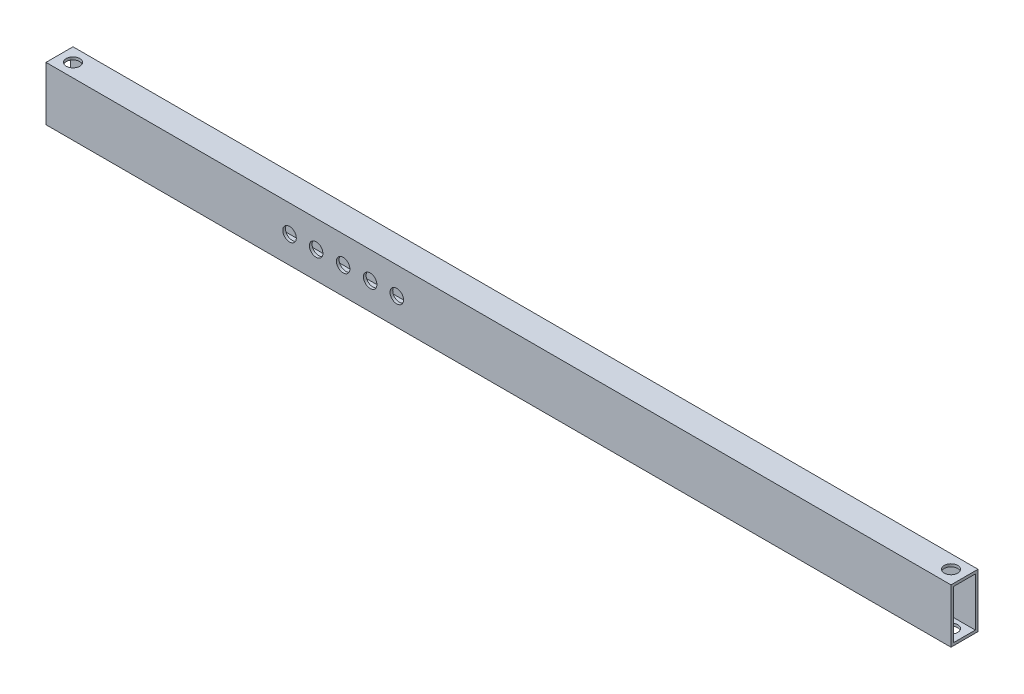
ISO-10303-21;
HEADER;
FILE_DESCRIPTION(('STEP AP214'),'2;1');
FILE_NAME('part.step','',(''),(''),'','','');
FILE_SCHEMA(('AUTOMOTIVE_DESIGN { 1 0 10303 214 1 1 1 1 }'));
ENDSEC;
DATA;
#1=APPLICATION_CONTEXT('core data for automotive mechanical design processes');
#2=APPLICATION_PROTOCOL_DEFINITION('international standard','automotive_design',2000,#1);
#3=PRODUCT_CONTEXT('',#1,'mechanical');
#4=PRODUCT('Part','Part','',(#3));
#5=PRODUCT_RELATED_PRODUCT_CATEGORY('part','',(#4));
#6=PRODUCT_DEFINITION_FORMATION('','',#4);
#7=PRODUCT_DEFINITION_CONTEXT('part definition',#1,'design');
#8=PRODUCT_DEFINITION('design','',#6,#7);
#9=PRODUCT_DEFINITION_SHAPE('','',#8);
#10=(LENGTH_UNIT() NAMED_UNIT(*) SI_UNIT(.MILLI.,.METRE.));
#11=(NAMED_UNIT(*) PLANE_ANGLE_UNIT() SI_UNIT($,.RADIAN.));
#12=(NAMED_UNIT(*) SI_UNIT($,.STERADIAN.) SOLID_ANGLE_UNIT());
#13=UNCERTAINTY_MEASURE_WITH_UNIT(LENGTH_MEASURE(1.E-05),#10,'distance_accuracy_value','');
#14=(GEOMETRIC_REPRESENTATION_CONTEXT(3) GLOBAL_UNCERTAINTY_ASSIGNED_CONTEXT((#13)) GLOBAL_UNIT_ASSIGNED_CONTEXT((#10,
#11,#12)) REPRESENTATION_CONTEXT('',''));
#15=CARTESIAN_POINT('',(0.,0.,0.));
#16=DIRECTION('',(0.,0.,1.));
#17=DIRECTION('',(1.,0.,0.));
#18=AXIS2_PLACEMENT_3D('',#15,#16,#17);
#19=CARTESIAN_POINT('',(-110.,-10.,-5.));
#20=DIRECTION('',(0.,0.,-1.));
#21=DIRECTION('',(-1.,0.,0.));
#22=AXIS2_PLACEMENT_3D('',#19,#20,#21);
#23=PLANE('',#22);
#24=DIRECTION('',(1.,0.,0.));
#25=VECTOR('',#24,1.);
#26=CARTESIAN_POINT('',(-110.,10.,-5.));
#27=LINE('',#26,#25);
#28=CARTESIAN_POINT('',(-110.,10.,-5.));
#29=VERTEX_POINT('',#28);
#30=CARTESIAN_POINT('',(225.,10.,-5.));
#31=VERTEX_POINT('',#30);
#32=EDGE_CURVE('E172',#29,#31,#27,.T.);
#33=ORIENTED_EDGE('',*,*,#32,.T.);
#34=DIRECTION('',(0.,1.,0.));
#35=VECTOR('',#34,1.);
#36=CARTESIAN_POINT('',(225.,-10.,-5.));
#37=LINE('',#36,#35);
#38=CARTESIAN_POINT('',(225.,-10.,-5.));
#39=VERTEX_POINT('',#38);
#40=EDGE_CURVE('E140',#39,#31,#37,.T.);
#41=ORIENTED_EDGE('',*,*,#40,.F.);
#42=DIRECTION('',(1.,0.,0.));
#43=VECTOR('',#42,1.);
#44=CARTESIAN_POINT('',(-110.,-10.,-5.));
#45=LINE('',#44,#43);
#46=CARTESIAN_POINT('',(-110.,-10.,-5.));
#47=VERTEX_POINT('',#46);
#48=EDGE_CURVE('E11',#47,#39,#45,.T.);
#49=ORIENTED_EDGE('',*,*,#48,.F.);
#50=DIRECTION('',(0.,1.,0.));
#51=VECTOR('',#50,1.);
#52=CARTESIAN_POINT('',(-110.,-10.,-5.));
#53=LINE('',#52,#51);
#54=EDGE_CURVE('E159',#47,#29,#53,.T.);
#55=ORIENTED_EDGE('',*,*,#54,.T.);
#56=EDGE_LOOP('',(#33,#41,#49,#55));
#57=FACE_BOUND('',#56,.T.);
#58=ADVANCED_FACE('F43',(#57),#23,.T.);
#59=CARTESIAN_POINT('',(-110.,-10.,5.));
#60=DIRECTION('',(0.,-1.,0.));
#61=DIRECTION('',(0.,0.,-1.));
#62=AXIS2_PLACEMENT_3D('',#59,#60,#61);
#63=PLANE('',#62);
#64=CARTESIAN_POINT('',(220.,-10.,0.));
#65=DIRECTION('',(0.,1.,0.));
#66=DIRECTION('',(0.,0.,1.));
#67=AXIS2_PLACEMENT_3D('',#64,#65,#66);
#68=CIRCLE('',#67,2.5);
#69=CARTESIAN_POINT('',(220.,-10.,2.5));
#70=VERTEX_POINT('',#69);
#71=EDGE_CURVE('E180',#70,#70,#68,.T.);
#72=ORIENTED_EDGE('',*,*,#71,.T.);
#73=EDGE_LOOP('',(#72));
#74=FACE_BOUND('',#73,.T.);
#75=CARTESIAN_POINT('',(-105.,-10.,0.));
#76=DIRECTION('',(0.,1.,0.));
#77=DIRECTION('',(0.,0.,1.));
#78=AXIS2_PLACEMENT_3D('',#75,#76,#77);
#79=CIRCLE('',#78,2.49999999999999);
#80=CARTESIAN_POINT('',(-105.,-10.,2.49999999999999));
#81=VERTEX_POINT('',#80);
#82=EDGE_CURVE('E196',#81,#81,#79,.T.);
#83=ORIENTED_EDGE('',*,*,#82,.T.);
#84=EDGE_LOOP('',(#83));
#85=FACE_BOUND('',#84,.T.);
#86=ORIENTED_EDGE('',*,*,#48,.T.);
#87=DIRECTION('',(0.,0.,-1.));
#88=VECTOR('',#87,1.);
#89=CARTESIAN_POINT('',(225.,-10.,5.));
#90=LINE('',#89,#88);
#91=CARTESIAN_POINT('',(225.,-10.,5.));
#92=VERTEX_POINT('',#91);
#93=EDGE_CURVE('E149',#92,#39,#90,.T.);
#94=ORIENTED_EDGE('',*,*,#93,.F.);
#95=DIRECTION('',(1.,0.,0.));
#96=VECTOR('',#95,1.);
#97=CARTESIAN_POINT('',(-110.,-10.,5.));
#98=LINE('',#97,#96);
#99=CARTESIAN_POINT('',(-110.,-10.,5.));
#100=VERTEX_POINT('',#99);
#101=EDGE_CURVE('E51',#100,#92,#98,.T.);
#102=ORIENTED_EDGE('',*,*,#101,.F.);
#103=DIRECTION('',(0.,0.,-1.));
#104=VECTOR('',#103,1.);
#105=CARTESIAN_POINT('',(-110.,-10.,5.));
#106=LINE('',#105,#104);
#107=EDGE_CURVE('E170',#100,#47,#106,.T.);
#108=ORIENTED_EDGE('',*,*,#107,.T.);
#109=EDGE_LOOP('',(#86,#94,#102,#108));
#110=FACE_BOUND('',#109,.T.);
#111=ADVANCED_FACE('F245',(#74,#85,#110),#63,.T.);
#112=CARTESIAN_POINT('',(-110.,-10.,5.));
#113=DIRECTION('',(0.,0.,1.));
#114=DIRECTION('',(1.,0.,0.));
#115=AXIS2_PLACEMENT_3D('',#112,#113,#114);
#116=PLANE('',#115);
#117=CARTESIAN_POINT('',(-19.85,0.,5.));
#118=DIRECTION('',(0.,0.,1.));
#119=DIRECTION('',(1.,0.,0.));
#120=AXIS2_PLACEMENT_3D('',#117,#118,#119);
#121=CIRCLE('',#120,2.5);
#122=CARTESIAN_POINT('',(-17.35,0.,5.));
#123=VERTEX_POINT('',#122);
#124=EDGE_CURVE('E205',#123,#123,#121,.T.);
#125=ORIENTED_EDGE('',*,*,#124,.F.);
#126=EDGE_LOOP('',(#125));
#127=FACE_BOUND('',#126,.T.);
#128=CARTESIAN_POINT('',(-10.,0.,5.));
#129=DIRECTION('',(0.,0.,1.));
#130=DIRECTION('',(1.,0.,0.));
#131=AXIS2_PLACEMENT_3D('',#128,#129,#130);
#132=CIRCLE('',#131,2.5);
#133=CARTESIAN_POINT('',(-7.5,0.,5.));
#134=VERTEX_POINT('',#133);
#135=EDGE_CURVE('E208',#134,#134,#132,.T.);
#136=ORIENTED_EDGE('',*,*,#135,.F.);
#137=EDGE_LOOP('',(#136));
#138=FACE_BOUND('',#137,.T.);
#139=CARTESIAN_POINT('',(0.,0.,5.));
#140=DIRECTION('',(0.,0.,1.));
#141=DIRECTION('',(1.,0.,0.));
#142=AXIS2_PLACEMENT_3D('',#139,#140,#141);
#143=CIRCLE('',#142,2.5);
#144=CARTESIAN_POINT('',(2.5,0.,5.));
#145=VERTEX_POINT('',#144);
#146=EDGE_CURVE('E214',#145,#145,#143,.T.);
#147=ORIENTED_EDGE('',*,*,#146,.F.);
#148=EDGE_LOOP('',(#147));
#149=FACE_BOUND('',#148,.T.);
#150=CARTESIAN_POINT('',(19.85,0.,5.));
#151=DIRECTION('',(0.,0.,1.));
#152=DIRECTION('',(-1.,0.,0.));
#153=AXIS2_PLACEMENT_3D('',#150,#151,#152);
#154=CIRCLE('',#153,2.5);
#155=CARTESIAN_POINT('',(17.35,0.,5.));
#156=VERTEX_POINT('',#155);
#157=EDGE_CURVE('E220',#156,#156,#154,.T.);
#158=ORIENTED_EDGE('',*,*,#157,.F.);
#159=EDGE_LOOP('',(#158));
#160=FACE_BOUND('',#159,.T.);
#161=CARTESIAN_POINT('',(10.,0.,5.));
#162=DIRECTION('',(0.,0.,1.));
#163=DIRECTION('',(-1.,0.,0.));
#164=AXIS2_PLACEMENT_3D('',#161,#162,#163);
#165=CIRCLE('',#164,2.5);
#166=CARTESIAN_POINT('',(7.5,0.,5.));
#167=VERTEX_POINT('',#166);
#168=EDGE_CURVE('E226',#167,#167,#165,.T.);
#169=ORIENTED_EDGE('',*,*,#168,.F.);
#170=EDGE_LOOP('',(#169));
#171=FACE_BOUND('',#170,.T.);
#172=ORIENTED_EDGE('',*,*,#101,.T.);
#173=DIRECTION('',(0.,-1.,0.));
#174=VECTOR('',#173,1.);
#175=CARTESIAN_POINT('',(225.,-10.,5.));
#176=LINE('',#175,#174);
#177=CARTESIAN_POINT('',(225.,10.,5.));
#178=VERTEX_POINT('',#177);
#179=EDGE_CURVE('E146',#178,#92,#176,.T.);
#180=ORIENTED_EDGE('',*,*,#179,.F.);
#181=DIRECTION('',(1.,0.,0.));
#182=VECTOR('',#181,1.);
#183=CARTESIAN_POINT('',(-110.,10.,5.));
#184=LINE('',#183,#182);
#185=CARTESIAN_POINT('',(-110.,10.,5.));
#186=VERTEX_POINT('',#185);
#187=EDGE_CURVE('E175',#186,#178,#184,.T.);
#188=ORIENTED_EDGE('',*,*,#187,.F.);
#189=DIRECTION('',(0.,-1.,0.));
#190=VECTOR('',#189,1.);
#191=CARTESIAN_POINT('',(-110.,-10.,5.));
#192=LINE('',#191,#190);
#193=EDGE_CURVE('E167',#186,#100,#192,.T.);
#194=ORIENTED_EDGE('',*,*,#193,.T.);
#195=EDGE_LOOP('',(#172,#180,#188,#194));
#196=FACE_BOUND('',#195,.T.);
#197=ADVANCED_FACE('F241',(#127,#138,#149,#160,#171,#196),#116,.T.);
#198=CARTESIAN_POINT('',(-110.,10.,5.));
#199=DIRECTION('',(0.,1.,0.));
#200=DIRECTION('',(0.,0.,1.));
#201=AXIS2_PLACEMENT_3D('',#198,#199,#200);
#202=PLANE('',#201);
#203=CARTESIAN_POINT('',(220.,10.,0.));
#204=DIRECTION('',(0.,1.,0.));
#205=DIRECTION('',(0.,0.,1.));
#206=AXIS2_PLACEMENT_3D('',#203,#204,#205);
#207=CIRCLE('',#206,2.5);
#208=CARTESIAN_POINT('',(220.,10.,2.5));
#209=VERTEX_POINT('',#208);
#210=EDGE_CURVE('E186',#209,#209,#207,.T.);
#211=ORIENTED_EDGE('',*,*,#210,.F.);
#212=EDGE_LOOP('',(#211));
#213=FACE_BOUND('',#212,.T.);
#214=CARTESIAN_POINT('',(-105.,10.,0.));
#215=DIRECTION('',(0.,1.,0.));
#216=DIRECTION('',(0.,0.,1.));
#217=AXIS2_PLACEMENT_3D('',#214,#215,#216);
#218=CIRCLE('',#217,2.49999999999999);
#219=CARTESIAN_POINT('',(-105.,10.,2.49999999999999));
#220=VERTEX_POINT('',#219);
#221=EDGE_CURVE('E191',#220,#220,#218,.T.);
#222=ORIENTED_EDGE('',*,*,#221,.F.);
#223=EDGE_LOOP('',(#222));
#224=FACE_BOUND('',#223,.T.);
#225=ORIENTED_EDGE('',*,*,#187,.T.);
#226=DIRECTION('',(0.,0.,1.));
#227=VECTOR('',#226,1.);
#228=CARTESIAN_POINT('',(225.,10.,5.));
#229=LINE('',#228,#227);
#230=EDGE_CURVE('E143',#31,#178,#229,.T.);
#231=ORIENTED_EDGE('',*,*,#230,.F.);
#232=ORIENTED_EDGE('',*,*,#32,.F.);
#233=DIRECTION('',(0.,0.,1.));
#234=VECTOR('',#233,1.);
#235=CARTESIAN_POINT('',(-110.,10.,5.));
#236=LINE('',#235,#234);
#237=EDGE_CURVE('E164',#29,#186,#236,.T.);
#238=ORIENTED_EDGE('',*,*,#237,.T.);
#239=EDGE_LOOP('',(#225,#231,#232,#238));
#240=FACE_BOUND('',#239,.T.);
#241=ADVANCED_FACE('F244',(#213,#224,#240),#202,.T.);
#242=CARTESIAN_POINT('',(-110.,0.,0.));
#243=DIRECTION('',(-1.,0.,0.));
#244=DIRECTION('',(0.,0.,1.));
#245=AXIS2_PLACEMENT_3D('',#242,#243,#244);
#246=PLANE('',#245);
#247=DIRECTION('',(0.,0.,-1.));
#248=VECTOR('',#247,1.);
#249=CARTESIAN_POINT('',(-110.,-9.,4.));
#250=LINE('',#249,#248);
#251=CARTESIAN_POINT('',(-110.,-9.,4.));
#252=VERTEX_POINT('',#251);
#253=CARTESIAN_POINT('',(-110.,-9.,-4.));
#254=VERTEX_POINT('',#253);
#255=EDGE_CURVE('E152',#252,#254,#250,.T.);
#256=ORIENTED_EDGE('',*,*,#255,.T.);
#257=DIRECTION('',(0.,1.,0.));
#258=VECTOR('',#257,1.);
#259=CARTESIAN_POINT('',(-110.,-9.,-4.));
#260=LINE('',#259,#258);
#261=CARTESIAN_POINT('',(-110.,9.,-4.));
#262=VERTEX_POINT('',#261);
#263=EDGE_CURVE('E115',#254,#262,#260,.T.);
#264=ORIENTED_EDGE('',*,*,#263,.T.);
#265=DIRECTION('',(0.,0.,1.));
#266=VECTOR('',#265,1.);
#267=CARTESIAN_POINT('',(-110.,9.,4.));
#268=LINE('',#267,#266);
#269=CARTESIAN_POINT('',(-110.,9.,4.));
#270=VERTEX_POINT('',#269);
#271=EDGE_CURVE('E59',#262,#270,#268,.T.);
#272=ORIENTED_EDGE('',*,*,#271,.T.);
#273=DIRECTION('',(0.,-1.,0.));
#274=VECTOR('',#273,1.);
#275=CARTESIAN_POINT('',(-110.,-9.,4.));
#276=LINE('',#275,#274);
#277=EDGE_CURVE('E120',#270,#252,#276,.T.);
#278=ORIENTED_EDGE('',*,*,#277,.T.);
#279=EDGE_LOOP('',(#256,#264,#272,#278));
#280=FACE_BOUND('',#279,.T.);
#281=ORIENTED_EDGE('',*,*,#54,.F.);
#282=ORIENTED_EDGE('',*,*,#107,.F.);
#283=ORIENTED_EDGE('',*,*,#193,.F.);
#284=ORIENTED_EDGE('',*,*,#237,.F.);
#285=EDGE_LOOP('',(#281,#282,#283,#284));
#286=FACE_BOUND('',#285,.T.);
#287=ADVANCED_FACE('F256',(#280,#286),#246,.T.);
#288=CARTESIAN_POINT('',(-110.,-9.,4.));
#289=DIRECTION('',(0.,-1.,0.));
#290=DIRECTION('',(0.,0.,-1.));
#291=AXIS2_PLACEMENT_3D('',#288,#289,#290);
#292=PLANE('',#291);
#293=CARTESIAN_POINT('',(220.,-9.,0.));
#294=DIRECTION('',(0.,-1.,0.));
#295=DIRECTION('',(0.,0.,-1.));
#296=AXIS2_PLACEMENT_3D('',#293,#294,#295);
#297=CIRCLE('',#296,2.5);
#298=CARTESIAN_POINT('',(220.,-9.,-2.5));
#299=VERTEX_POINT('',#298);
#300=EDGE_CURVE('E199',#299,#299,#297,.T.);
#301=ORIENTED_EDGE('',*,*,#300,.T.);
#302=EDGE_LOOP('',(#301));
#303=FACE_BOUND('',#302,.T.);
#304=CARTESIAN_POINT('',(-105.,-9.,0.));
#305=DIRECTION('',(0.,-1.,0.));
#306=DIRECTION('',(0.,0.,-1.));
#307=AXIS2_PLACEMENT_3D('',#304,#305,#306);
#308=CIRCLE('',#307,2.49999999999999);
#309=CARTESIAN_POINT('',(-105.,-9.,-2.49999999999999));
#310=VERTEX_POINT('',#309);
#311=EDGE_CURVE('E179',#310,#310,#308,.T.);
#312=ORIENTED_EDGE('',*,*,#311,.T.);
#313=EDGE_LOOP('',(#312));
#314=FACE_BOUND('',#313,.T.);
#315=DIRECTION('',(1.,0.,0.));
#316=VECTOR('',#315,1.);
#317=CARTESIAN_POINT('',(-110.,-9.,4.));
#318=LINE('',#317,#316);
#319=CARTESIAN_POINT('',(225.,-9.,4.));
#320=VERTEX_POINT('',#319);
#321=EDGE_CURVE('E125',#252,#320,#318,.T.);
#322=ORIENTED_EDGE('',*,*,#321,.T.);
#323=DIRECTION('',(0.,0.,-1.));
#324=VECTOR('',#323,1.);
#325=CARTESIAN_POINT('',(225.,-9.,4.));
#326=LINE('',#325,#324);
#327=CARTESIAN_POINT('',(225.,-9.,-4.));
#328=VERTEX_POINT('',#327);
#329=EDGE_CURVE('E123',#320,#328,#326,.T.);
#330=ORIENTED_EDGE('',*,*,#329,.T.);
#331=DIRECTION('',(1.,0.,0.));
#332=VECTOR('',#331,1.);
#333=CARTESIAN_POINT('',(-110.,-9.,-4.));
#334=LINE('',#333,#332);
#335=EDGE_CURVE('E108',#254,#328,#334,.T.);
#336=ORIENTED_EDGE('',*,*,#335,.F.);
#337=ORIENTED_EDGE('',*,*,#255,.F.);
#338=EDGE_LOOP('',(#322,#330,#336,#337));
#339=FACE_BOUND('',#338,.T.);
#340=ADVANCED_FACE('F124',(#303,#314,#339),#292,.F.);
#341=CARTESIAN_POINT('',(-110.,-9.,4.));
#342=DIRECTION('',(0.,0.,1.));
#343=DIRECTION('',(1.,0.,0.));
#344=AXIS2_PLACEMENT_3D('',#341,#342,#343);
#345=PLANE('',#344);
#346=CARTESIAN_POINT('',(-19.85,0.,4.));
#347=DIRECTION('',(0.,0.,1.));
#348=DIRECTION('',(1.,0.,0.));
#349=AXIS2_PLACEMENT_3D('',#346,#347,#348);
#350=CIRCLE('',#349,2.5);
#351=CARTESIAN_POINT('',(-17.35,0.,4.));
#352=VERTEX_POINT('',#351);
#353=EDGE_CURVE('E129',#352,#352,#350,.T.);
#354=ORIENTED_EDGE('',*,*,#353,.T.);
#355=EDGE_LOOP('',(#354));
#356=FACE_BOUND('',#355,.T.);
#357=CARTESIAN_POINT('',(-10.,0.,4.));
#358=DIRECTION('',(0.,0.,1.));
#359=DIRECTION('',(1.,0.,0.));
#360=AXIS2_PLACEMENT_3D('',#357,#358,#359);
#361=CIRCLE('',#360,2.5);
#362=CARTESIAN_POINT('',(-7.5,0.,4.));
#363=VERTEX_POINT('',#362);
#364=EDGE_CURVE('E211',#363,#363,#361,.T.);
#365=ORIENTED_EDGE('',*,*,#364,.T.);
#366=EDGE_LOOP('',(#365));
#367=FACE_BOUND('',#366,.T.);
#368=CARTESIAN_POINT('',(0.,0.,4.));
#369=DIRECTION('',(0.,0.,1.));
#370=DIRECTION('',(1.,0.,0.));
#371=AXIS2_PLACEMENT_3D('',#368,#369,#370);
#372=CIRCLE('',#371,2.5);
#373=CARTESIAN_POINT('',(2.5,0.,4.));
#374=VERTEX_POINT('',#373);
#375=EDGE_CURVE('E217',#374,#374,#372,.T.);
#376=ORIENTED_EDGE('',*,*,#375,.T.);
#377=EDGE_LOOP('',(#376));
#378=FACE_BOUND('',#377,.T.);
#379=CARTESIAN_POINT('',(19.85,0.,4.));
#380=DIRECTION('',(0.,0.,1.));
#381=DIRECTION('',(-1.,0.,0.));
#382=AXIS2_PLACEMENT_3D('',#379,#380,#381);
#383=CIRCLE('',#382,2.5);
#384=CARTESIAN_POINT('',(17.35,0.,4.));
#385=VERTEX_POINT('',#384);
#386=EDGE_CURVE('E223',#385,#385,#383,.T.);
#387=ORIENTED_EDGE('',*,*,#386,.T.);
#388=EDGE_LOOP('',(#387));
#389=FACE_BOUND('',#388,.T.);
#390=CARTESIAN_POINT('',(10.,0.,4.));
#391=DIRECTION('',(0.,0.,1.));
#392=DIRECTION('',(-1.,0.,0.));
#393=AXIS2_PLACEMENT_3D('',#390,#391,#392);
#394=CIRCLE('',#393,2.5);
#395=CARTESIAN_POINT('',(7.5,0.,4.));
#396=VERTEX_POINT('',#395);
#397=EDGE_CURVE('E202',#396,#396,#394,.T.);
#398=ORIENTED_EDGE('',*,*,#397,.T.);
#399=EDGE_LOOP('',(#398));
#400=FACE_BOUND('',#399,.T.);
#401=DIRECTION('',(1.,0.,0.));
#402=VECTOR('',#401,1.);
#403=CARTESIAN_POINT('',(-110.,9.,4.));
#404=LINE('',#403,#402);
#405=CARTESIAN_POINT('',(225.,9.,4.));
#406=VERTEX_POINT('',#405);
#407=EDGE_CURVE('E160',#270,#406,#404,.T.);
#408=ORIENTED_EDGE('',*,*,#407,.T.);
#409=DIRECTION('',(0.,-1.,0.));
#410=VECTOR('',#409,1.);
#411=CARTESIAN_POINT('',(225.,-9.,4.));
#412=LINE('',#411,#410);
#413=EDGE_CURVE('E135',#406,#320,#412,.T.);
#414=ORIENTED_EDGE('',*,*,#413,.T.);
#415=ORIENTED_EDGE('',*,*,#321,.F.);
#416=ORIENTED_EDGE('',*,*,#277,.F.);
#417=EDGE_LOOP('',(#408,#414,#415,#416));
#418=FACE_BOUND('',#417,.T.);
#419=ADVANCED_FACE('F231',(#356,#367,#378,#389,#400,#418),#345,.F.);
#420=CARTESIAN_POINT('',(-110.,9.,4.));
#421=DIRECTION('',(0.,1.,0.));
#422=DIRECTION('',(0.,0.,1.));
#423=AXIS2_PLACEMENT_3D('',#420,#421,#422);
#424=PLANE('',#423);
#425=CARTESIAN_POINT('',(220.,9.,0.));
#426=DIRECTION('',(0.,1.,0.));
#427=DIRECTION('',(0.,0.,1.));
#428=AXIS2_PLACEMENT_3D('',#425,#426,#427);
#429=CIRCLE('',#428,2.5);
#430=CARTESIAN_POINT('',(220.,9.,2.5));
#431=VERTEX_POINT('',#430);
#432=EDGE_CURVE('E46',#431,#431,#429,.T.);
#433=ORIENTED_EDGE('',*,*,#432,.T.);
#434=EDGE_LOOP('',(#433));
#435=FACE_BOUND('',#434,.T.);
#436=CARTESIAN_POINT('',(-105.,9.,0.));
#437=DIRECTION('',(0.,1.,0.));
#438=DIRECTION('',(0.,0.,1.));
#439=AXIS2_PLACEMENT_3D('',#436,#437,#438);
#440=CIRCLE('',#439,2.49999999999999);
#441=CARTESIAN_POINT('',(-105.,9.,2.49999999999999));
#442=VERTEX_POINT('',#441);
#443=EDGE_CURVE('E177',#442,#442,#440,.T.);
#444=ORIENTED_EDGE('',*,*,#443,.T.);
#445=EDGE_LOOP('',(#444));
#446=FACE_BOUND('',#445,.T.);
#447=DIRECTION('',(1.,0.,0.));
#448=VECTOR('',#447,1.);
#449=CARTESIAN_POINT('',(-110.,9.,-4.));
#450=LINE('',#449,#448);
#451=CARTESIAN_POINT('',(225.,9.,-4.));
#452=VERTEX_POINT('',#451);
#453=EDGE_CURVE('E119',#262,#452,#450,.T.);
#454=ORIENTED_EDGE('',*,*,#453,.T.);
#455=DIRECTION('',(0.,0.,1.));
#456=VECTOR('',#455,1.);
#457=CARTESIAN_POINT('',(225.,9.,4.));
#458=LINE('',#457,#456);
#459=EDGE_CURVE('E133',#452,#406,#458,.T.);
#460=ORIENTED_EDGE('',*,*,#459,.T.);
#461=ORIENTED_EDGE('',*,*,#407,.F.);
#462=ORIENTED_EDGE('',*,*,#271,.F.);
#463=EDGE_LOOP('',(#454,#460,#461,#462));
#464=FACE_BOUND('',#463,.T.);
#465=ADVANCED_FACE('F283',(#435,#446,#464),#424,.F.);
#466=CARTESIAN_POINT('',(-110.,-9.,-4.));
#467=DIRECTION('',(0.,0.,-1.));
#468=DIRECTION('',(0.,1.,0.));
#469=AXIS2_PLACEMENT_3D('',#466,#467,#468);
#470=PLANE('',#469);
#471=ORIENTED_EDGE('',*,*,#335,.T.);
#472=DIRECTION('',(0.,1.,0.));
#473=VECTOR('',#472,1.);
#474=CARTESIAN_POINT('',(225.,-9.,-4.));
#475=LINE('',#474,#473);
#476=EDGE_CURVE('E112',#328,#452,#475,.T.);
#477=ORIENTED_EDGE('',*,*,#476,.T.);
#478=ORIENTED_EDGE('',*,*,#453,.F.);
#479=ORIENTED_EDGE('',*,*,#263,.F.);
#480=EDGE_LOOP('',(#471,#477,#478,#479));
#481=FACE_BOUND('',#480,.T.);
#482=ADVANCED_FACE('F110',(#481),#470,.F.);
#483=CARTESIAN_POINT('',(225.,0.,0.));
#484=DIRECTION('',(-1.,0.,0.));
#485=DIRECTION('',(0.,0.,1.));
#486=AXIS2_PLACEMENT_3D('',#483,#484,#485);
#487=PLANE('',#486);
#488=ORIENTED_EDGE('',*,*,#40,.T.);
#489=ORIENTED_EDGE('',*,*,#230,.T.);
#490=ORIENTED_EDGE('',*,*,#179,.T.);
#491=ORIENTED_EDGE('',*,*,#93,.T.);
#492=EDGE_LOOP('',(#488,#489,#490,#491));
#493=FACE_BOUND('',#492,.T.);
#494=ORIENTED_EDGE('',*,*,#329,.F.);
#495=ORIENTED_EDGE('',*,*,#413,.F.);
#496=ORIENTED_EDGE('',*,*,#459,.F.);
#497=ORIENTED_EDGE('',*,*,#476,.F.);
#498=EDGE_LOOP('',(#494,#495,#496,#497));
#499=FACE_BOUND('',#498,.T.);
#500=ADVANCED_FACE('F131',(#493,#499),#487,.F.);
#501=CARTESIAN_POINT('',(10.,0.,4.));
#502=DIRECTION('',(0.,0.,1.));
#503=DIRECTION('',(1.,0.,0.));
#504=AXIS2_PLACEMENT_3D('',#501,#502,#503);
#505=CYLINDRICAL_SURFACE('',#504,2.5);
#506=ORIENTED_EDGE('',*,*,#397,.F.);
#507=EDGE_LOOP('',(#506));
#508=FACE_BOUND('',#507,.T.);
#509=ORIENTED_EDGE('',*,*,#168,.T.);
#510=EDGE_LOOP('',(#509));
#511=FACE_BOUND('',#510,.T.);
#512=ADVANCED_FACE('F234',(#508,#511),#505,.F.);
#513=CARTESIAN_POINT('',(19.85,0.,4.));
#514=DIRECTION('',(0.,0.,1.));
#515=DIRECTION('',(1.,0.,0.));
#516=AXIS2_PLACEMENT_3D('',#513,#514,#515);
#517=CYLINDRICAL_SURFACE('',#516,2.5);
#518=ORIENTED_EDGE('',*,*,#386,.F.);
#519=EDGE_LOOP('',(#518));
#520=FACE_BOUND('',#519,.T.);
#521=ORIENTED_EDGE('',*,*,#157,.T.);
#522=EDGE_LOOP('',(#521));
#523=FACE_BOUND('',#522,.T.);
#524=ADVANCED_FACE('F237',(#520,#523),#517,.F.);
#525=CARTESIAN_POINT('',(0.,0.,4.));
#526=DIRECTION('',(0.,0.,1.));
#527=DIRECTION('',(1.,0.,0.));
#528=AXIS2_PLACEMENT_3D('',#525,#526,#527);
#529=CYLINDRICAL_SURFACE('',#528,2.5);
#530=ORIENTED_EDGE('',*,*,#375,.F.);
#531=EDGE_LOOP('',(#530));
#532=FACE_BOUND('',#531,.T.);
#533=ORIENTED_EDGE('',*,*,#146,.T.);
#534=EDGE_LOOP('',(#533));
#535=FACE_BOUND('',#534,.T.);
#536=ADVANCED_FACE('F294',(#532,#535),#529,.F.);
#537=CARTESIAN_POINT('',(-10.,0.,4.));
#538=DIRECTION('',(0.,0.,1.));
#539=DIRECTION('',(1.,0.,0.));
#540=AXIS2_PLACEMENT_3D('',#537,#538,#539);
#541=CYLINDRICAL_SURFACE('',#540,2.5);
#542=ORIENTED_EDGE('',*,*,#364,.F.);
#543=EDGE_LOOP('',(#542));
#544=FACE_BOUND('',#543,.T.);
#545=ORIENTED_EDGE('',*,*,#135,.T.);
#546=EDGE_LOOP('',(#545));
#547=FACE_BOUND('',#546,.T.);
#548=ADVANCED_FACE('F298',(#544,#547),#541,.F.);
#549=CARTESIAN_POINT('',(-19.85,0.,4.));
#550=DIRECTION('',(0.,0.,1.));
#551=DIRECTION('',(1.,0.,0.));
#552=AXIS2_PLACEMENT_3D('',#549,#550,#551);
#553=CYLINDRICAL_SURFACE('',#552,2.5);
#554=ORIENTED_EDGE('',*,*,#353,.F.);
#555=EDGE_LOOP('',(#554));
#556=FACE_BOUND('',#555,.T.);
#557=ORIENTED_EDGE('',*,*,#124,.T.);
#558=EDGE_LOOP('',(#557));
#559=FACE_BOUND('',#558,.T.);
#560=ADVANCED_FACE('F302',(#556,#559),#553,.F.);
#561=CARTESIAN_POINT('',(-105.,-10.,0.));
#562=DIRECTION('',(0.,1.,0.));
#563=DIRECTION('',(0.,0.,1.));
#564=AXIS2_PLACEMENT_3D('',#561,#562,#563);
#565=CYLINDRICAL_SURFACE('',#564,2.49999999999999);
#566=ORIENTED_EDGE('',*,*,#221,.T.);
#567=EDGE_LOOP('',(#566));
#568=FACE_BOUND('',#567,.T.);
#569=ORIENTED_EDGE('',*,*,#443,.F.);
#570=EDGE_LOOP('',(#569));
#571=FACE_BOUND('',#570,.T.);
#572=ADVANCED_FACE('F305',(#568,#571),#565,.F.);
#573=CARTESIAN_POINT('',(220.,-10.,0.));
#574=DIRECTION('',(0.,1.,0.));
#575=DIRECTION('',(0.,0.,1.));
#576=AXIS2_PLACEMENT_3D('',#573,#574,#575);
#577=CYLINDRICAL_SURFACE('',#576,2.5);
#578=ORIENTED_EDGE('',*,*,#210,.T.);
#579=EDGE_LOOP('',(#578));
#580=FACE_BOUND('',#579,.T.);
#581=ORIENTED_EDGE('',*,*,#432,.F.);
#582=EDGE_LOOP('',(#581));
#583=FACE_BOUND('',#582,.T.);
#584=ADVANCED_FACE('F311',(#580,#583),#577,.F.);
#585=ORIENTED_EDGE('',*,*,#82,.F.);
#586=EDGE_LOOP('',(#585));
#587=FACE_BOUND('',#586,.T.);
#588=ORIENTED_EDGE('',*,*,#311,.F.);
#589=EDGE_LOOP('',(#588));
#590=FACE_BOUND('',#589,.T.);
#591=ADVANCED_FACE('F307',(#587,#590),#565,.F.);
#592=ORIENTED_EDGE('',*,*,#71,.F.);
#593=EDGE_LOOP('',(#592));
#594=FACE_BOUND('',#593,.T.);
#595=ORIENTED_EDGE('',*,*,#300,.F.);
#596=EDGE_LOOP('',(#595));
#597=FACE_BOUND('',#596,.T.);
#598=ADVANCED_FACE('F310',(#594,#597),#577,.F.);
#599=CLOSED_SHELL('',(#58,#111,#197,#241,#287,#340,#419,#465,#482,#500,#512,#524,#536,#548,#560,
#572,#584,#591,#598));
#600=MANIFOLD_SOLID_BREP('B2',#599);
#601=ADVANCED_BREP_SHAPE_REPRESENTATION('',(#18,#600),#14);
#602=SHAPE_DEFINITION_REPRESENTATION(#9,#601);
ENDSEC;
END-ISO-10303-21;
